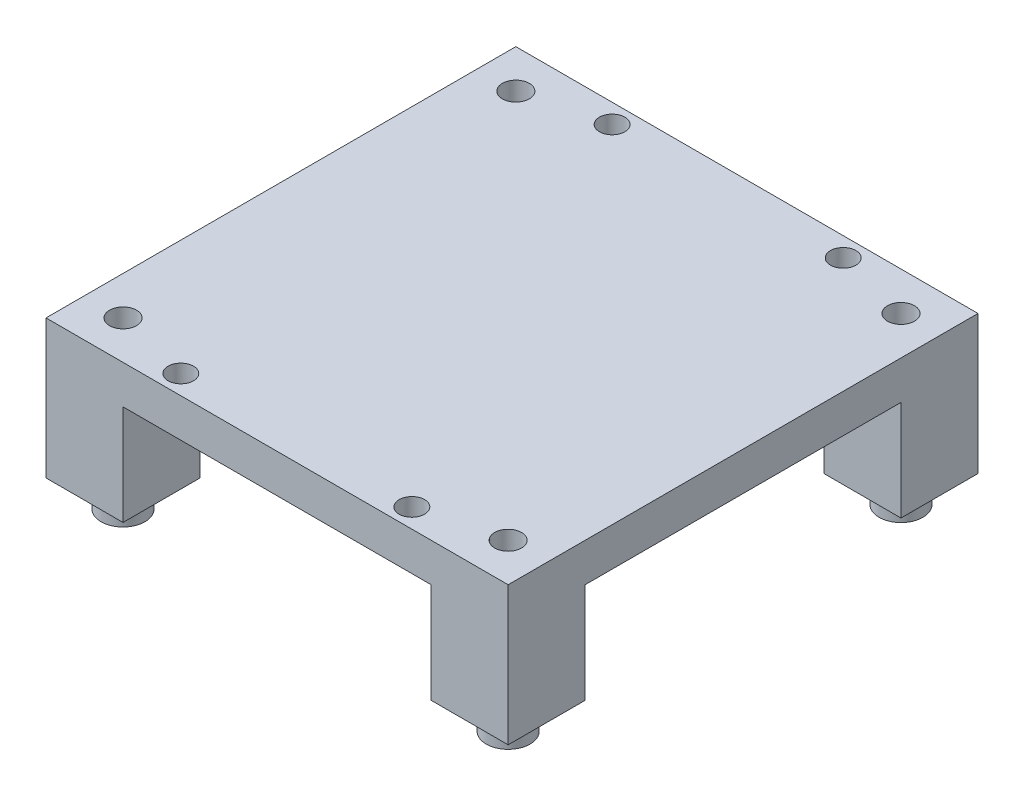
ISO-10303-21;
HEADER;
FILE_DESCRIPTION(('STEP AP214'),'2;1');
FILE_NAME('part.step','',(''),(''),'','','');
FILE_SCHEMA(('AUTOMOTIVE_DESIGN { 1 0 10303 214 1 1 1 1 }'));
ENDSEC;
DATA;
#1=APPLICATION_CONTEXT('core data for automotive mechanical design processes');
#2=APPLICATION_PROTOCOL_DEFINITION('international standard','automotive_design',2000,#1);
#3=PRODUCT_CONTEXT('',#1,'mechanical');
#4=PRODUCT('Part','Part','',(#3));
#5=PRODUCT_RELATED_PRODUCT_CATEGORY('part','',(#4));
#6=PRODUCT_DEFINITION_FORMATION('','',#4);
#7=PRODUCT_DEFINITION_CONTEXT('part definition',#1,'design');
#8=PRODUCT_DEFINITION('design','',#6,#7);
#9=PRODUCT_DEFINITION_SHAPE('','',#8);
#10=(LENGTH_UNIT() NAMED_UNIT(*) SI_UNIT(.MILLI.,.METRE.));
#11=(NAMED_UNIT(*) PLANE_ANGLE_UNIT() SI_UNIT($,.RADIAN.));
#12=(NAMED_UNIT(*) SI_UNIT($,.STERADIAN.) SOLID_ANGLE_UNIT());
#13=UNCERTAINTY_MEASURE_WITH_UNIT(LENGTH_MEASURE(1.E-05),#10,'distance_accuracy_value','');
#14=(GEOMETRIC_REPRESENTATION_CONTEXT(3) GLOBAL_UNCERTAINTY_ASSIGNED_CONTEXT((#13)) GLOBAL_UNIT_ASSIGNED_CONTEXT((#10,
#11,#12)) REPRESENTATION_CONTEXT('',''));
#15=CARTESIAN_POINT('',(0.,0.,0.));
#16=DIRECTION('',(0.,0.,1.));
#17=DIRECTION('',(1.,0.,0.));
#18=AXIS2_PLACEMENT_3D('',#15,#16,#17);
#19=CARTESIAN_POINT('',(0.,5.,0.));
#20=DIRECTION('',(0.,-1.,0.));
#21=DIRECTION('',(0.,0.,-1.));
#22=AXIS2_PLACEMENT_3D('',#19,#20,#21);
#23=PLANE('',#22);
#24=CARTESIAN_POINT('',(5.,5.,-5.));
#25=DIRECTION('',(0.,-1.,0.));
#26=DIRECTION('',(0.,0.,-1.));
#27=AXIS2_PLACEMENT_3D('',#24,#25,#26);
#28=CIRCLE('',#27,1.75000000000001);
#29=CARTESIAN_POINT('',(5.,5.,-6.75000000000001));
#30=VERTEX_POINT('',#29);
#31=EDGE_CURVE('E391',#30,#30,#28,.T.);
#32=ORIENTED_EDGE('',*,*,#31,.T.);
#33=EDGE_LOOP('',(#32));
#34=FACE_BOUND('',#33,.T.);
#35=CARTESIAN_POINT('',(5.,5.,-56.));
#36=DIRECTION('',(0.,-1.,0.));
#37=DIRECTION('',(0.,0.,-1.));
#38=AXIS2_PLACEMENT_3D('',#35,#36,#37);
#39=CIRCLE('',#38,1.75000000000001);
#40=CARTESIAN_POINT('',(5.,5.,-57.75));
#41=VERTEX_POINT('',#40);
#42=EDGE_CURVE('E388',#41,#41,#39,.T.);
#43=ORIENTED_EDGE('',*,*,#42,.T.);
#44=EDGE_LOOP('',(#43));
#45=FACE_BOUND('',#44,.T.);
#46=CARTESIAN_POINT('',(55.,5.,-56.));
#47=DIRECTION('',(0.,-1.,0.));
#48=DIRECTION('',(0.,0.,-1.));
#49=AXIS2_PLACEMENT_3D('',#46,#47,#48);
#50=CIRCLE('',#49,1.75000000000001);
#51=CARTESIAN_POINT('',(55.,5.,-57.75));
#52=VERTEX_POINT('',#51);
#53=EDGE_CURVE('E385',#52,#52,#50,.T.);
#54=ORIENTED_EDGE('',*,*,#53,.T.);
#55=EDGE_LOOP('',(#54));
#56=FACE_BOUND('',#55,.T.);
#57=CARTESIAN_POINT('',(55.,5.,-5.));
#58=DIRECTION('',(0.,-1.,0.));
#59=DIRECTION('',(0.,0.,-1.));
#60=AXIS2_PLACEMENT_3D('',#57,#58,#59);
#61=CIRCLE('',#60,1.75000000000001);
#62=CARTESIAN_POINT('',(55.,5.,-6.75000000000001));
#63=VERTEX_POINT('',#62);
#64=EDGE_CURVE('E380',#63,#63,#61,.T.);
#65=ORIENTED_EDGE('',*,*,#64,.T.);
#66=EDGE_LOOP('',(#65));
#67=FACE_BOUND('',#66,.T.);
#68=CARTESIAN_POINT('',(15.,5.,-58.5));
#69=DIRECTION('',(0.,1.,0.));
#70=DIRECTION('',(0.,0.,1.));
#71=AXIS2_PLACEMENT_3D('',#68,#69,#70);
#72=CIRCLE('',#71,1.65000000000001);
#73=CARTESIAN_POINT('',(15.,5.,-56.85));
#74=VERTEX_POINT('',#73);
#75=EDGE_CURVE('E209',#74,#74,#72,.T.);
#76=ORIENTED_EDGE('',*,*,#75,.F.);
#77=EDGE_LOOP('',(#76));
#78=FACE_BOUND('',#77,.T.);
#79=CARTESIAN_POINT('',(45.,5.,-2.49999999999999));
#80=DIRECTION('',(0.,1.,0.));
#81=DIRECTION('',(0.,0.,1.));
#82=AXIS2_PLACEMENT_3D('',#79,#80,#81);
#83=CIRCLE('',#82,1.65000000000001);
#84=CARTESIAN_POINT('',(45.,5.,-0.849999999999976));
#85=VERTEX_POINT('',#84);
#86=EDGE_CURVE('E354',#85,#85,#83,.T.);
#87=ORIENTED_EDGE('',*,*,#86,.F.);
#88=EDGE_LOOP('',(#87));
#89=FACE_BOUND('',#88,.T.);
#90=CARTESIAN_POINT('',(15.,5.,-2.49999999999999));
#91=DIRECTION('',(0.,1.,0.));
#92=DIRECTION('',(0.,0.,1.));
#93=AXIS2_PLACEMENT_3D('',#90,#91,#92);
#94=CIRCLE('',#93,1.65000000000001);
#95=CARTESIAN_POINT('',(15.,5.,-0.849999999999976));
#96=VERTEX_POINT('',#95);
#97=EDGE_CURVE('E348',#96,#96,#94,.T.);
#98=ORIENTED_EDGE('',*,*,#97,.F.);
#99=EDGE_LOOP('',(#98));
#100=FACE_BOUND('',#99,.T.);
#101=DIRECTION('',(0.,0.,1.));
#102=VECTOR('',#101,1.);
#103=CARTESIAN_POINT('',(0.,5.,0.));
#104=LINE('',#103,#102);
#105=CARTESIAN_POINT('',(0.,5.,-61.));
#106=VERTEX_POINT('',#105);
#107=CARTESIAN_POINT('',(0.,5.,0.));
#108=VERTEX_POINT('',#107);
#109=EDGE_CURVE('E197',#106,#108,#104,.T.);
#110=ORIENTED_EDGE('',*,*,#109,.T.);
#111=DIRECTION('',(1.,0.,0.));
#112=VECTOR('',#111,1.);
#113=CARTESIAN_POINT('',(0.,5.,0.));
#114=LINE('',#113,#112);
#115=CARTESIAN_POINT('',(60.,5.,0.));
#116=VERTEX_POINT('',#115);
#117=EDGE_CURVE('E288',#108,#116,#114,.T.);
#118=ORIENTED_EDGE('',*,*,#117,.T.);
#119=DIRECTION('',(0.,0.,-1.));
#120=VECTOR('',#119,1.);
#121=CARTESIAN_POINT('',(60.,5.,0.));
#122=LINE('',#121,#120);
#123=CARTESIAN_POINT('',(60.,5.,-61.));
#124=VERTEX_POINT('',#123);
#125=EDGE_CURVE('E289',#116,#124,#122,.T.);
#126=ORIENTED_EDGE('',*,*,#125,.T.);
#127=DIRECTION('',(-1.,0.,0.));
#128=VECTOR('',#127,1.);
#129=CARTESIAN_POINT('',(0.,5.,-61.));
#130=LINE('',#129,#128);
#131=EDGE_CURVE('E190',#124,#106,#130,.T.);
#132=ORIENTED_EDGE('',*,*,#131,.T.);
#133=EDGE_LOOP('',(#110,#118,#126,#132));
#134=FACE_BOUND('',#133,.T.);
#135=CARTESIAN_POINT('',(45.,5.,-58.5));
#136=DIRECTION('',(0.,1.,0.));
#137=DIRECTION('',(0.,0.,1.));
#138=AXIS2_PLACEMENT_3D('',#135,#136,#137);
#139=CIRCLE('',#138,1.65000000000001);
#140=CARTESIAN_POINT('',(45.,5.,-56.85));
#141=VERTEX_POINT('',#140);
#142=EDGE_CURVE('E208',#141,#141,#139,.T.);
#143=ORIENTED_EDGE('',*,*,#142,.F.);
#144=EDGE_LOOP('',(#143));
#145=FACE_BOUND('',#144,.T.);
#146=ADVANCED_FACE('F39',(#34,#45,#56,#67,#78,#89,#100,#134,#145),#23,.F.);
#147=CARTESIAN_POINT('',(0.,0.,0.));
#148=DIRECTION('',(0.,-1.,0.));
#149=DIRECTION('',(0.,0.,-1.));
#150=AXIS2_PLACEMENT_3D('',#147,#148,#149);
#151=PLANE('',#150);
#152=CARTESIAN_POINT('',(15.,0.,-58.5));
#153=DIRECTION('',(0.,-1.,0.));
#154=DIRECTION('',(0.,0.,-1.));
#155=AXIS2_PLACEMENT_3D('',#152,#153,#154);
#156=CIRCLE('',#155,1.65000000000001);
#157=CARTESIAN_POINT('',(15.,0.,-60.15));
#158=VERTEX_POINT('',#157);
#159=EDGE_CURVE('E206',#158,#158,#156,.T.);
#160=ORIENTED_EDGE('',*,*,#159,.F.);
#161=EDGE_LOOP('',(#160));
#162=FACE_BOUND('',#161,.T.);
#163=CARTESIAN_POINT('',(45.,0.,-58.5));
#164=DIRECTION('',(0.,-1.,0.));
#165=DIRECTION('',(0.,0.,-1.));
#166=AXIS2_PLACEMENT_3D('',#163,#164,#165);
#167=CIRCLE('',#166,1.65000000000001);
#168=CARTESIAN_POINT('',(45.,0.,-60.15));
#169=VERTEX_POINT('',#168);
#170=EDGE_CURVE('E357',#169,#169,#167,.T.);
#171=ORIENTED_EDGE('',*,*,#170,.F.);
#172=EDGE_LOOP('',(#171));
#173=FACE_BOUND('',#172,.T.);
#174=CARTESIAN_POINT('',(45.,0.,-2.49999999999999));
#175=DIRECTION('',(0.,-1.,0.));
#176=DIRECTION('',(0.,0.,-1.));
#177=AXIS2_PLACEMENT_3D('',#174,#175,#176);
#178=CIRCLE('',#177,1.65000000000001);
#179=CARTESIAN_POINT('',(45.,0.,-4.15));
#180=VERTEX_POINT('',#179);
#181=EDGE_CURVE('E351',#180,#180,#178,.T.);
#182=ORIENTED_EDGE('',*,*,#181,.F.);
#183=EDGE_LOOP('',(#182));
#184=FACE_BOUND('',#183,.T.);
#185=CARTESIAN_POINT('',(15.,0.,-2.49999999999999));
#186=DIRECTION('',(0.,-1.,0.));
#187=DIRECTION('',(0.,0.,-1.));
#188=AXIS2_PLACEMENT_3D('',#185,#186,#187);
#189=CIRCLE('',#188,1.65000000000001);
#190=CARTESIAN_POINT('',(15.,0.,-4.15));
#191=VERTEX_POINT('',#190);
#192=EDGE_CURVE('E339',#191,#191,#189,.T.);
#193=ORIENTED_EDGE('',*,*,#192,.F.);
#194=EDGE_LOOP('',(#193));
#195=FACE_BOUND('',#194,.T.);
#196=DIRECTION('',(-1.,0.,0.));
#197=VECTOR('',#196,1.);
#198=CARTESIAN_POINT('',(0.,0.,-51.));
#199=LINE('',#198,#197);
#200=CARTESIAN_POINT('',(10.,0.,-51.));
#201=VERTEX_POINT('',#200);
#202=CARTESIAN_POINT('',(0.,0.,-51.));
#203=VERTEX_POINT('',#202);
#204=EDGE_CURVE('E156',#201,#203,#199,.T.);
#205=ORIENTED_EDGE('',*,*,#204,.F.);
#206=DIRECTION('',(0.,0.,1.));
#207=VECTOR('',#206,1.);
#208=CARTESIAN_POINT('',(10.,0.,-61.));
#209=LINE('',#208,#207);
#210=CARTESIAN_POINT('',(10.,0.,-61.));
#211=VERTEX_POINT('',#210);
#212=EDGE_CURVE('E167',#211,#201,#209,.T.);
#213=ORIENTED_EDGE('',*,*,#212,.F.);
#214=DIRECTION('',(-1.,0.,0.));
#215=VECTOR('',#214,1.);
#216=CARTESIAN_POINT('',(0.,0.,-61.));
#217=LINE('',#216,#215);
#218=CARTESIAN_POINT('',(50.,0.,-61.));
#219=VERTEX_POINT('',#218);
#220=EDGE_CURVE('E195',#219,#211,#217,.T.);
#221=ORIENTED_EDGE('',*,*,#220,.F.);
#222=DIRECTION('',(0.,0.,-1.));
#223=VECTOR('',#222,1.);
#224=CARTESIAN_POINT('',(50.,0.,-61.));
#225=LINE('',#224,#223);
#226=CARTESIAN_POINT('',(50.,0.,-51.));
#227=VERTEX_POINT('',#226);
#228=EDGE_CURVE('E235',#227,#219,#225,.T.);
#229=ORIENTED_EDGE('',*,*,#228,.F.);
#230=DIRECTION('',(-1.,0.,0.));
#231=VECTOR('',#230,1.);
#232=CARTESIAN_POINT('',(60.,0.,-51.));
#233=LINE('',#232,#231);
#234=CARTESIAN_POINT('',(60.,0.,-51.));
#235=VERTEX_POINT('',#234);
#236=EDGE_CURVE('E237',#235,#227,#233,.T.);
#237=ORIENTED_EDGE('',*,*,#236,.F.);
#238=DIRECTION('',(0.,0.,-1.));
#239=VECTOR('',#238,1.);
#240=CARTESIAN_POINT('',(60.,0.,0.));
#241=LINE('',#240,#239);
#242=CARTESIAN_POINT('',(60.,0.,-10.));
#243=VERTEX_POINT('',#242);
#244=EDGE_CURVE('E185',#243,#235,#241,.T.);
#245=ORIENTED_EDGE('',*,*,#244,.F.);
#246=DIRECTION('',(1.,0.,0.));
#247=VECTOR('',#246,1.);
#248=CARTESIAN_POINT('',(60.,0.,-10.));
#249=LINE('',#248,#247);
#250=CARTESIAN_POINT('',(50.,0.,-10.));
#251=VERTEX_POINT('',#250);
#252=EDGE_CURVE('E255',#251,#243,#249,.T.);
#253=ORIENTED_EDGE('',*,*,#252,.F.);
#254=DIRECTION('',(0.,0.,-1.));
#255=VECTOR('',#254,1.);
#256=CARTESIAN_POINT('',(50.,0.,0.));
#257=LINE('',#256,#255);
#258=CARTESIAN_POINT('',(50.,0.,0.));
#259=VERTEX_POINT('',#258);
#260=EDGE_CURVE('E257',#259,#251,#257,.T.);
#261=ORIENTED_EDGE('',*,*,#260,.F.);
#262=DIRECTION('',(1.,0.,0.));
#263=VECTOR('',#262,1.);
#264=CARTESIAN_POINT('',(0.,0.,0.));
#265=LINE('',#264,#263);
#266=CARTESIAN_POINT('',(10.,0.,0.));
#267=VERTEX_POINT('',#266);
#268=EDGE_CURVE('E181',#267,#259,#265,.T.);
#269=ORIENTED_EDGE('',*,*,#268,.F.);
#270=DIRECTION('',(0.,0.,1.));
#271=VECTOR('',#270,1.);
#272=CARTESIAN_POINT('',(10.,0.,0.));
#273=LINE('',#272,#271);
#274=CARTESIAN_POINT('',(10.,0.,-10.));
#275=VERTEX_POINT('',#274);
#276=EDGE_CURVE('E271',#275,#267,#273,.T.);
#277=ORIENTED_EDGE('',*,*,#276,.F.);
#278=DIRECTION('',(1.,0.,0.));
#279=VECTOR('',#278,1.);
#280=CARTESIAN_POINT('',(0.,0.,-10.));
#281=LINE('',#280,#279);
#282=CARTESIAN_POINT('',(0.,0.,-10.));
#283=VERTEX_POINT('',#282);
#284=EDGE_CURVE('E179',#283,#275,#281,.T.);
#285=ORIENTED_EDGE('',*,*,#284,.F.);
#286=DIRECTION('',(0.,0.,1.));
#287=VECTOR('',#286,1.);
#288=CARTESIAN_POINT('',(0.,0.,0.));
#289=LINE('',#288,#287);
#290=EDGE_CURVE('E172',#203,#283,#289,.T.);
#291=ORIENTED_EDGE('',*,*,#290,.F.);
#292=EDGE_LOOP('',(#205,#213,#221,#229,#237,#245,#253,#261,#269,#277,#285,#291));
#293=FACE_BOUND('',#292,.T.);
#294=ADVANCED_FACE('F177',(#162,#173,#184,#195,#293),#151,.T.);
#295=CARTESIAN_POINT('',(0.,5.,0.));
#296=DIRECTION('',(1.,0.,0.));
#297=DIRECTION('',(0.,0.,-1.));
#298=AXIS2_PLACEMENT_3D('',#295,#296,#297);
#299=PLANE('',#298);
#300=DIRECTION('',(0.,-1.,0.));
#301=VECTOR('',#300,1.);
#302=CARTESIAN_POINT('',(0.,5.,-61.));
#303=LINE('',#302,#301);
#304=CARTESIAN_POINT('',(0.,-13.,-61.));
#305=VERTEX_POINT('',#304);
#306=EDGE_CURVE('E198',#106,#305,#303,.T.);
#307=ORIENTED_EDGE('',*,*,#306,.T.);
#308=DIRECTION('',(0.,0.,-1.));
#309=VECTOR('',#308,1.);
#310=CARTESIAN_POINT('',(0.,-13.,-61.));
#311=LINE('',#310,#309);
#312=CARTESIAN_POINT('',(0.,-13.,-51.));
#313=VERTEX_POINT('',#312);
#314=EDGE_CURVE('E168',#313,#305,#311,.T.);
#315=ORIENTED_EDGE('',*,*,#314,.F.);
#316=DIRECTION('',(0.,1.,0.));
#317=VECTOR('',#316,1.);
#318=CARTESIAN_POINT('',(0.,-13.,-51.));
#319=LINE('',#318,#317);
#320=EDGE_CURVE('E160',#313,#203,#319,.T.);
#321=ORIENTED_EDGE('',*,*,#320,.T.);
#322=ORIENTED_EDGE('',*,*,#290,.T.);
#323=DIRECTION('',(0.,1.,0.));
#324=VECTOR('',#323,1.);
#325=CARTESIAN_POINT('',(0.,-13.,-10.));
#326=LINE('',#325,#324);
#327=CARTESIAN_POINT('',(0.,-13.,-10.));
#328=VERTEX_POINT('',#327);
#329=EDGE_CURVE('E182',#328,#283,#326,.T.);
#330=ORIENTED_EDGE('',*,*,#329,.F.);
#331=DIRECTION('',(0.,0.,-1.));
#332=VECTOR('',#331,1.);
#333=CARTESIAN_POINT('',(0.,-13.,0.));
#334=LINE('',#333,#332);
#335=CARTESIAN_POINT('',(0.,-13.,0.));
#336=VERTEX_POINT('',#335);
#337=EDGE_CURVE('E267',#336,#328,#334,.T.);
#338=ORIENTED_EDGE('',*,*,#337,.F.);
#339=DIRECTION('',(0.,-1.,0.));
#340=VECTOR('',#339,1.);
#341=CARTESIAN_POINT('',(0.,5.,0.));
#342=LINE('',#341,#340);
#343=EDGE_CURVE('E204',#108,#336,#342,.T.);
#344=ORIENTED_EDGE('',*,*,#343,.F.);
#345=ORIENTED_EDGE('',*,*,#109,.F.);
#346=EDGE_LOOP('',(#307,#315,#321,#322,#330,#338,#344,#345));
#347=FACE_BOUND('',#346,.T.);
#348=ADVANCED_FACE('F41',(#347),#299,.F.);
#349=CARTESIAN_POINT('',(0.,5.,0.));
#350=DIRECTION('',(0.,0.,-1.));
#351=DIRECTION('',(-1.,0.,0.));
#352=AXIS2_PLACEMENT_3D('',#349,#350,#351);
#353=PLANE('',#352);
#354=ORIENTED_EDGE('',*,*,#343,.T.);
#355=DIRECTION('',(-1.,0.,0.));
#356=VECTOR('',#355,1.);
#357=CARTESIAN_POINT('',(0.,-13.,0.));
#358=LINE('',#357,#356);
#359=CARTESIAN_POINT('',(10.,-13.,0.));
#360=VERTEX_POINT('',#359);
#361=EDGE_CURVE('E275',#360,#336,#358,.T.);
#362=ORIENTED_EDGE('',*,*,#361,.F.);
#363=DIRECTION('',(0.,1.,0.));
#364=VECTOR('',#363,1.);
#365=CARTESIAN_POINT('',(10.,-13.,0.));
#366=LINE('',#365,#364);
#367=EDGE_CURVE('E278',#360,#267,#366,.T.);
#368=ORIENTED_EDGE('',*,*,#367,.T.);
#369=ORIENTED_EDGE('',*,*,#268,.T.);
#370=DIRECTION('',(0.,1.,0.));
#371=VECTOR('',#370,1.);
#372=CARTESIAN_POINT('',(50.,-13.,0.));
#373=LINE('',#372,#371);
#374=CARTESIAN_POINT('',(50.,-13.,0.));
#375=VERTEX_POINT('',#374);
#376=EDGE_CURVE('E240',#375,#259,#373,.T.);
#377=ORIENTED_EDGE('',*,*,#376,.F.);
#378=DIRECTION('',(-1.,0.,0.));
#379=VECTOR('',#378,1.);
#380=CARTESIAN_POINT('',(60.,-13.,0.));
#381=LINE('',#380,#379);
#382=CARTESIAN_POINT('',(60.,-13.,0.));
#383=VERTEX_POINT('',#382);
#384=EDGE_CURVE('E263',#383,#375,#381,.T.);
#385=ORIENTED_EDGE('',*,*,#384,.F.);
#386=DIRECTION('',(0.,-1.,0.));
#387=VECTOR('',#386,1.);
#388=CARTESIAN_POINT('',(60.,5.,0.));
#389=LINE('',#388,#387);
#390=EDGE_CURVE('E202',#116,#383,#389,.T.);
#391=ORIENTED_EDGE('',*,*,#390,.F.);
#392=ORIENTED_EDGE('',*,*,#117,.F.);
#393=EDGE_LOOP('',(#354,#362,#368,#369,#377,#385,#391,#392));
#394=FACE_BOUND('',#393,.T.);
#395=ADVANCED_FACE('F302',(#394),#353,.F.);
#396=CARTESIAN_POINT('',(60.,5.,0.));
#397=DIRECTION('',(-1.,0.,0.));
#398=DIRECTION('',(0.,0.,1.));
#399=AXIS2_PLACEMENT_3D('',#396,#397,#398);
#400=PLANE('',#399);
#401=ORIENTED_EDGE('',*,*,#390,.T.);
#402=DIRECTION('',(0.,0.,1.));
#403=VECTOR('',#402,1.);
#404=CARTESIAN_POINT('',(60.,-13.,0.));
#405=LINE('',#404,#403);
#406=CARTESIAN_POINT('',(60.,-13.,-10.));
#407=VERTEX_POINT('',#406);
#408=EDGE_CURVE('E258',#407,#383,#405,.T.);
#409=ORIENTED_EDGE('',*,*,#408,.F.);
#410=DIRECTION('',(0.,1.,0.));
#411=VECTOR('',#410,1.);
#412=CARTESIAN_POINT('',(60.,-13.,-10.));
#413=LINE('',#412,#411);
#414=EDGE_CURVE('E251',#407,#243,#413,.T.);
#415=ORIENTED_EDGE('',*,*,#414,.T.);
#416=ORIENTED_EDGE('',*,*,#244,.T.);
#417=DIRECTION('',(0.,1.,0.));
#418=VECTOR('',#417,1.);
#419=CARTESIAN_POINT('',(60.,-13.,-51.));
#420=LINE('',#419,#418);
#421=CARTESIAN_POINT('',(60.,-13.,-51.));
#422=VERTEX_POINT('',#421);
#423=EDGE_CURVE('E228',#422,#235,#420,.T.);
#424=ORIENTED_EDGE('',*,*,#423,.F.);
#425=DIRECTION('',(0.,0.,1.));
#426=VECTOR('',#425,1.);
#427=CARTESIAN_POINT('',(60.,-13.,-61.));
#428=LINE('',#427,#426);
#429=CARTESIAN_POINT('',(60.,-13.,-61.));
#430=VERTEX_POINT('',#429);
#431=EDGE_CURVE('E238',#430,#422,#428,.T.);
#432=ORIENTED_EDGE('',*,*,#431,.F.);
#433=DIRECTION('',(0.,-1.,0.));
#434=VECTOR('',#433,1.);
#435=CARTESIAN_POINT('',(60.,5.,-61.));
#436=LINE('',#435,#434);
#437=EDGE_CURVE('E200',#124,#430,#436,.T.);
#438=ORIENTED_EDGE('',*,*,#437,.F.);
#439=ORIENTED_EDGE('',*,*,#125,.F.);
#440=EDGE_LOOP('',(#401,#409,#415,#416,#424,#432,#438,#439));
#441=FACE_BOUND('',#440,.T.);
#442=ADVANCED_FACE('F324',(#441),#400,.F.);
#443=CARTESIAN_POINT('',(0.,5.,-61.));
#444=DIRECTION('',(0.,0.,1.));
#445=DIRECTION('',(1.,0.,0.));
#446=AXIS2_PLACEMENT_3D('',#443,#444,#445);
#447=PLANE('',#446);
#448=ORIENTED_EDGE('',*,*,#437,.T.);
#449=DIRECTION('',(1.,0.,0.));
#450=VECTOR('',#449,1.);
#451=CARTESIAN_POINT('',(60.,-13.,-61.));
#452=LINE('',#451,#450);
#453=CARTESIAN_POINT('',(50.,-13.,-61.));
#454=VERTEX_POINT('',#453);
#455=EDGE_CURVE('E234',#454,#430,#452,.T.);
#456=ORIENTED_EDGE('',*,*,#455,.F.);
#457=DIRECTION('',(0.,1.,0.));
#458=VECTOR('',#457,1.);
#459=CARTESIAN_POINT('',(50.,-13.,-61.));
#460=LINE('',#459,#458);
#461=EDGE_CURVE('E54',#454,#219,#460,.T.);
#462=ORIENTED_EDGE('',*,*,#461,.T.);
#463=ORIENTED_EDGE('',*,*,#220,.T.);
#464=DIRECTION('',(0.,1.,0.));
#465=VECTOR('',#464,1.);
#466=CARTESIAN_POINT('',(10.,-13.,-61.));
#467=LINE('',#466,#465);
#468=CARTESIAN_POINT('',(10.,-13.,-61.));
#469=VERTEX_POINT('',#468);
#470=EDGE_CURVE('E336',#469,#211,#467,.T.);
#471=ORIENTED_EDGE('',*,*,#470,.F.);
#472=DIRECTION('',(1.,0.,0.));
#473=VECTOR('',#472,1.);
#474=CARTESIAN_POINT('',(0.,-13.,-61.));
#475=LINE('',#474,#473);
#476=EDGE_CURVE('E221',#305,#469,#475,.T.);
#477=ORIENTED_EDGE('',*,*,#476,.F.);
#478=ORIENTED_EDGE('',*,*,#306,.F.);
#479=ORIENTED_EDGE('',*,*,#131,.F.);
#480=EDGE_LOOP('',(#448,#456,#462,#463,#471,#477,#478,#479));
#481=FACE_BOUND('',#480,.T.);
#482=ADVANCED_FACE('F298',(#481),#447,.F.);
#483=CARTESIAN_POINT('',(0.,-13.,-10.));
#484=DIRECTION('',(0.,0.,1.));
#485=DIRECTION('',(1.,0.,0.));
#486=AXIS2_PLACEMENT_3D('',#483,#484,#485);
#487=PLANE('',#486);
#488=ORIENTED_EDGE('',*,*,#284,.T.);
#489=DIRECTION('',(0.,1.,0.));
#490=VECTOR('',#489,1.);
#491=CARTESIAN_POINT('',(10.,-13.,-10.));
#492=LINE('',#491,#490);
#493=CARTESIAN_POINT('',(10.,-13.,-10.));
#494=VERTEX_POINT('',#493);
#495=EDGE_CURVE('E187',#494,#275,#492,.T.);
#496=ORIENTED_EDGE('',*,*,#495,.F.);
#497=DIRECTION('',(1.,0.,0.));
#498=VECTOR('',#497,1.);
#499=CARTESIAN_POINT('',(0.,-13.,-10.));
#500=LINE('',#499,#498);
#501=EDGE_CURVE('E270',#328,#494,#500,.T.);
#502=ORIENTED_EDGE('',*,*,#501,.F.);
#503=ORIENTED_EDGE('',*,*,#329,.T.);
#504=EDGE_LOOP('',(#488,#496,#502,#503));
#505=FACE_BOUND('',#504,.T.);
#506=ADVANCED_FACE('F433',(#505),#487,.F.);
#507=CARTESIAN_POINT('',(10.,-13.,0.));
#508=DIRECTION('',(-1.,0.,0.));
#509=DIRECTION('',(0.,0.,1.));
#510=AXIS2_PLACEMENT_3D('',#507,#508,#509);
#511=PLANE('',#510);
#512=ORIENTED_EDGE('',*,*,#276,.T.);
#513=ORIENTED_EDGE('',*,*,#367,.F.);
#514=DIRECTION('',(0.,0.,1.));
#515=VECTOR('',#514,1.);
#516=CARTESIAN_POINT('',(10.,-13.,0.));
#517=LINE('',#516,#515);
#518=EDGE_CURVE('E273',#494,#360,#517,.T.);
#519=ORIENTED_EDGE('',*,*,#518,.F.);
#520=ORIENTED_EDGE('',*,*,#495,.T.);
#521=EDGE_LOOP('',(#512,#513,#519,#520));
#522=FACE_BOUND('',#521,.T.);
#523=ADVANCED_FACE('F310',(#522),#511,.F.);
#524=CARTESIAN_POINT('',(0.,-13.,0.));
#525=DIRECTION('',(0.,-1.,0.));
#526=DIRECTION('',(0.,0.,-1.));
#527=AXIS2_PLACEMENT_3D('',#524,#525,#526);
#528=PLANE('',#527);
#529=CARTESIAN_POINT('',(5.,-13.,-5.));
#530=DIRECTION('',(0.,-1.,0.));
#531=DIRECTION('',(0.,0.,-1.));
#532=AXIS2_PLACEMENT_3D('',#529,#530,#531);
#533=CIRCLE('',#532,2.85);
#534=CARTESIAN_POINT('',(5.,-13.,-7.85));
#535=VERTEX_POINT('',#534);
#536=EDGE_CURVE('E376',#535,#535,#533,.T.);
#537=ORIENTED_EDGE('',*,*,#536,.F.);
#538=EDGE_LOOP('',(#537));
#539=FACE_BOUND('',#538,.T.);
#540=ORIENTED_EDGE('',*,*,#337,.T.);
#541=ORIENTED_EDGE('',*,*,#501,.T.);
#542=ORIENTED_EDGE('',*,*,#518,.T.);
#543=ORIENTED_EDGE('',*,*,#361,.T.);
#544=EDGE_LOOP('',(#540,#541,#542,#543));
#545=FACE_BOUND('',#544,.T.);
#546=ADVANCED_FACE('F305',(#539,#545),#528,.T.);
#547=CARTESIAN_POINT('',(50.,-13.,0.));
#548=DIRECTION('',(1.,0.,0.));
#549=DIRECTION('',(0.,0.,-1.));
#550=AXIS2_PLACEMENT_3D('',#547,#548,#549);
#551=PLANE('',#550);
#552=ORIENTED_EDGE('',*,*,#260,.T.);
#553=DIRECTION('',(0.,1.,0.));
#554=VECTOR('',#553,1.);
#555=CARTESIAN_POINT('',(50.,-13.,-10.));
#556=LINE('',#555,#554);
#557=CARTESIAN_POINT('',(50.,-13.,-10.));
#558=VERTEX_POINT('',#557);
#559=EDGE_CURVE('E62',#558,#251,#556,.T.);
#560=ORIENTED_EDGE('',*,*,#559,.F.);
#561=DIRECTION('',(0.,0.,-1.));
#562=VECTOR('',#561,1.);
#563=CARTESIAN_POINT('',(50.,-13.,0.));
#564=LINE('',#563,#562);
#565=EDGE_CURVE('E261',#375,#558,#564,.T.);
#566=ORIENTED_EDGE('',*,*,#565,.F.);
#567=ORIENTED_EDGE('',*,*,#376,.T.);
#568=EDGE_LOOP('',(#552,#560,#566,#567));
#569=FACE_BOUND('',#568,.T.);
#570=ADVANCED_FACE('F318',(#569),#551,.F.);
#571=CARTESIAN_POINT('',(60.,-13.,-10.));
#572=DIRECTION('',(0.,0.,1.));
#573=DIRECTION('',(1.,0.,0.));
#574=AXIS2_PLACEMENT_3D('',#571,#572,#573);
#575=PLANE('',#574);
#576=ORIENTED_EDGE('',*,*,#252,.T.);
#577=ORIENTED_EDGE('',*,*,#414,.F.);
#578=DIRECTION('',(1.,0.,0.));
#579=VECTOR('',#578,1.);
#580=CARTESIAN_POINT('',(60.,-13.,-10.));
#581=LINE('',#580,#579);
#582=EDGE_CURVE('E254',#558,#407,#581,.T.);
#583=ORIENTED_EDGE('',*,*,#582,.F.);
#584=ORIENTED_EDGE('',*,*,#559,.T.);
#585=EDGE_LOOP('',(#576,#577,#583,#584));
#586=FACE_BOUND('',#585,.T.);
#587=ADVANCED_FACE('F430',(#586),#575,.F.);
#588=CARTESIAN_POINT('',(0.,-13.,0.));
#589=DIRECTION('',(0.,1.,0.));
#590=DIRECTION('',(0.,0.,1.));
#591=AXIS2_PLACEMENT_3D('',#588,#589,#590);
#592=PLANE('',#591);
#593=CARTESIAN_POINT('',(55.,-13.,-5.));
#594=DIRECTION('',(0.,1.,0.));
#595=DIRECTION('',(0.,0.,1.));
#596=AXIS2_PLACEMENT_3D('',#593,#594,#595);
#597=CIRCLE('',#596,2.85);
#598=CARTESIAN_POINT('',(55.,-13.,-2.15000000000001));
#599=VERTEX_POINT('',#598);
#600=EDGE_CURVE('E11',#599,#599,#597,.F.);
#601=ORIENTED_EDGE('',*,*,#600,.F.);
#602=EDGE_LOOP('',(#601));
#603=FACE_BOUND('',#602,.T.);
#604=ORIENTED_EDGE('',*,*,#408,.T.);
#605=ORIENTED_EDGE('',*,*,#384,.T.);
#606=ORIENTED_EDGE('',*,*,#565,.T.);
#607=ORIENTED_EDGE('',*,*,#582,.T.);
#608=EDGE_LOOP('',(#604,#605,#606,#607));
#609=FACE_BOUND('',#608,.T.);
#610=ADVANCED_FACE('F320',(#603,#609),#592,.F.);
#611=CARTESIAN_POINT('',(60.,-13.,-51.));
#612=DIRECTION('',(0.,0.,-1.));
#613=DIRECTION('',(-1.,0.,0.));
#614=AXIS2_PLACEMENT_3D('',#611,#612,#613);
#615=PLANE('',#614);
#616=ORIENTED_EDGE('',*,*,#236,.T.);
#617=DIRECTION('',(0.,1.,0.));
#618=VECTOR('',#617,1.);
#619=CARTESIAN_POINT('',(50.,-13.,-51.));
#620=LINE('',#619,#618);
#621=CARTESIAN_POINT('',(50.,-13.,-51.));
#622=VERTEX_POINT('',#621);
#623=EDGE_CURVE('E230',#622,#227,#620,.T.);
#624=ORIENTED_EDGE('',*,*,#623,.F.);
#625=DIRECTION('',(-1.,0.,0.));
#626=VECTOR('',#625,1.);
#627=CARTESIAN_POINT('',(60.,-13.,-51.));
#628=LINE('',#627,#626);
#629=EDGE_CURVE('E245',#422,#622,#628,.T.);
#630=ORIENTED_EDGE('',*,*,#629,.F.);
#631=ORIENTED_EDGE('',*,*,#423,.T.);
#632=EDGE_LOOP('',(#616,#624,#630,#631));
#633=FACE_BOUND('',#632,.T.);
#634=ADVANCED_FACE('F534',(#633),#615,.F.);
#635=CARTESIAN_POINT('',(50.,-13.,-61.));
#636=DIRECTION('',(1.,0.,0.));
#637=DIRECTION('',(0.,0.,-1.));
#638=AXIS2_PLACEMENT_3D('',#635,#636,#637);
#639=PLANE('',#638);
#640=ORIENTED_EDGE('',*,*,#228,.T.);
#641=ORIENTED_EDGE('',*,*,#461,.F.);
#642=DIRECTION('',(0.,0.,-1.));
#643=VECTOR('',#642,1.);
#644=CARTESIAN_POINT('',(50.,-13.,-61.));
#645=LINE('',#644,#643);
#646=EDGE_CURVE('E243',#622,#454,#645,.T.);
#647=ORIENTED_EDGE('',*,*,#646,.F.);
#648=ORIENTED_EDGE('',*,*,#623,.T.);
#649=EDGE_LOOP('',(#640,#641,#647,#648));
#650=FACE_BOUND('',#649,.T.);
#651=ADVANCED_FACE('F332',(#650),#639,.F.);
#652=CARTESIAN_POINT('',(0.,-13.,0.));
#653=DIRECTION('',(0.,-1.,0.));
#654=DIRECTION('',(0.,0.,-1.));
#655=AXIS2_PLACEMENT_3D('',#652,#653,#654);
#656=PLANE('',#655);
#657=CARTESIAN_POINT('',(55.,-13.,-56.));
#658=DIRECTION('',(0.,-1.,0.));
#659=DIRECTION('',(0.,0.,-1.));
#660=AXIS2_PLACEMENT_3D('',#657,#658,#659);
#661=CIRCLE('',#660,2.85);
#662=CARTESIAN_POINT('',(55.,-13.,-58.85));
#663=VERTEX_POINT('',#662);
#664=EDGE_CURVE('E367',#663,#663,#661,.T.);
#665=ORIENTED_EDGE('',*,*,#664,.F.);
#666=EDGE_LOOP('',(#665));
#667=FACE_BOUND('',#666,.T.);
#668=ORIENTED_EDGE('',*,*,#431,.T.);
#669=ORIENTED_EDGE('',*,*,#629,.T.);
#670=ORIENTED_EDGE('',*,*,#646,.T.);
#671=ORIENTED_EDGE('',*,*,#455,.T.);
#672=EDGE_LOOP('',(#668,#669,#670,#671));
#673=FACE_BOUND('',#672,.T.);
#674=ADVANCED_FACE('F328',(#667,#673),#656,.T.);
#675=CARTESIAN_POINT('',(10.,-13.,-61.));
#676=DIRECTION('',(-1.,0.,0.));
#677=DIRECTION('',(0.,0.,1.));
#678=AXIS2_PLACEMENT_3D('',#675,#676,#677);
#679=PLANE('',#678);
#680=ORIENTED_EDGE('',*,*,#212,.T.);
#681=DIRECTION('',(0.,1.,0.));
#682=VECTOR('',#681,1.);
#683=CARTESIAN_POINT('',(10.,-13.,-51.));
#684=LINE('',#683,#682);
#685=CARTESIAN_POINT('',(10.,-13.,-51.));
#686=VERTEX_POINT('',#685);
#687=EDGE_CURVE('E163',#686,#201,#684,.T.);
#688=ORIENTED_EDGE('',*,*,#687,.F.);
#689=DIRECTION('',(0.,0.,1.));
#690=VECTOR('',#689,1.);
#691=CARTESIAN_POINT('',(10.,-13.,-61.));
#692=LINE('',#691,#690);
#693=EDGE_CURVE('E224',#469,#686,#692,.T.);
#694=ORIENTED_EDGE('',*,*,#693,.F.);
#695=ORIENTED_EDGE('',*,*,#470,.T.);
#696=EDGE_LOOP('',(#680,#688,#694,#695));
#697=FACE_BOUND('',#696,.T.);
#698=ADVANCED_FACE('F341',(#697),#679,.F.);
#699=CARTESIAN_POINT('',(0.,-13.,-51.));
#700=DIRECTION('',(0.,0.,-1.));
#701=DIRECTION('',(-1.,0.,0.));
#702=AXIS2_PLACEMENT_3D('',#699,#700,#701);
#703=PLANE('',#702);
#704=ORIENTED_EDGE('',*,*,#204,.T.);
#705=ORIENTED_EDGE('',*,*,#320,.F.);
#706=DIRECTION('',(-1.,0.,0.));
#707=VECTOR('',#706,1.);
#708=CARTESIAN_POINT('',(0.,-13.,-51.));
#709=LINE('',#708,#707);
#710=EDGE_CURVE('E175',#686,#313,#709,.T.);
#711=ORIENTED_EDGE('',*,*,#710,.F.);
#712=ORIENTED_EDGE('',*,*,#687,.T.);
#713=EDGE_LOOP('',(#704,#705,#711,#712));
#714=FACE_BOUND('',#713,.T.);
#715=ADVANCED_FACE('F158',(#714),#703,.F.);
#716=CARTESIAN_POINT('',(0.,-13.,0.));
#717=DIRECTION('',(0.,1.,0.));
#718=DIRECTION('',(0.,0.,1.));
#719=AXIS2_PLACEMENT_3D('',#716,#717,#718);
#720=PLANE('',#719);
#721=CARTESIAN_POINT('',(5.,-13.,-56.));
#722=DIRECTION('',(0.,1.,0.));
#723=DIRECTION('',(0.,0.,1.));
#724=AXIS2_PLACEMENT_3D('',#721,#722,#723);
#725=CIRCLE('',#724,2.85);
#726=CARTESIAN_POINT('',(5.,-13.,-53.15));
#727=VERTEX_POINT('',#726);
#728=EDGE_CURVE('E47',#727,#727,#725,.F.);
#729=ORIENTED_EDGE('',*,*,#728,.F.);
#730=EDGE_LOOP('',(#729));
#731=FACE_BOUND('',#730,.T.);
#732=ORIENTED_EDGE('',*,*,#314,.T.);
#733=ORIENTED_EDGE('',*,*,#476,.T.);
#734=ORIENTED_EDGE('',*,*,#693,.T.);
#735=ORIENTED_EDGE('',*,*,#710,.T.);
#736=EDGE_LOOP('',(#732,#733,#734,#735));
#737=FACE_BOUND('',#736,.T.);
#738=ADVANCED_FACE('F215',(#731,#737),#720,.F.);
#739=CARTESIAN_POINT('',(15.,5.,-2.49999999999999));
#740=DIRECTION('',(0.,1.,0.));
#741=DIRECTION('',(0.,0.,1.));
#742=AXIS2_PLACEMENT_3D('',#739,#740,#741);
#743=CYLINDRICAL_SURFACE('',#742,1.65000000000001);
#744=ORIENTED_EDGE('',*,*,#192,.T.);
#745=EDGE_LOOP('',(#744));
#746=FACE_BOUND('',#745,.T.);
#747=ORIENTED_EDGE('',*,*,#97,.T.);
#748=EDGE_LOOP('',(#747));
#749=FACE_BOUND('',#748,.T.);
#750=ADVANCED_FACE('F218',(#746,#749),#743,.F.);
#751=CARTESIAN_POINT('',(45.,5.,-2.49999999999999));
#752=DIRECTION('',(0.,1.,0.));
#753=DIRECTION('',(0.,0.,1.));
#754=AXIS2_PLACEMENT_3D('',#751,#752,#753);
#755=CYLINDRICAL_SURFACE('',#754,1.65000000000001);
#756=ORIENTED_EDGE('',*,*,#181,.T.);
#757=EDGE_LOOP('',(#756));
#758=FACE_BOUND('',#757,.T.);
#759=ORIENTED_EDGE('',*,*,#86,.T.);
#760=EDGE_LOOP('',(#759));
#761=FACE_BOUND('',#760,.T.);
#762=ADVANCED_FACE('F595',(#758,#761),#755,.F.);
#763=CARTESIAN_POINT('',(45.,5.,-58.5));
#764=DIRECTION('',(0.,1.,0.));
#765=DIRECTION('',(0.,0.,1.));
#766=AXIS2_PLACEMENT_3D('',#763,#764,#765);
#767=CYLINDRICAL_SURFACE('',#766,1.65000000000001);
#768=ORIENTED_EDGE('',*,*,#170,.T.);
#769=EDGE_LOOP('',(#768));
#770=FACE_BOUND('',#769,.T.);
#771=ORIENTED_EDGE('',*,*,#142,.T.);
#772=EDGE_LOOP('',(#771));
#773=FACE_BOUND('',#772,.T.);
#774=ADVANCED_FACE('F605',(#770,#773),#767,.F.);
#775=CARTESIAN_POINT('',(15.,5.,-58.5));
#776=DIRECTION('',(0.,1.,0.));
#777=DIRECTION('',(0.,0.,1.));
#778=AXIS2_PLACEMENT_3D('',#775,#776,#777);
#779=CYLINDRICAL_SURFACE('',#778,1.65000000000001);
#780=ORIENTED_EDGE('',*,*,#159,.T.);
#781=EDGE_LOOP('',(#780));
#782=FACE_BOUND('',#781,.T.);
#783=ORIENTED_EDGE('',*,*,#75,.T.);
#784=EDGE_LOOP('',(#783));
#785=FACE_BOUND('',#784,.T.);
#786=ADVANCED_FACE('F615',(#782,#785),#779,.F.);
#787=CARTESIAN_POINT('',(5.,-16.5,-56.));
#788=DIRECTION('',(0.,1.,0.));
#789=DIRECTION('',(0.,0.,1.));
#790=AXIS2_PLACEMENT_3D('',#787,#788,#789);
#791=CYLINDRICAL_SURFACE('',#790,2.85);
#792=CARTESIAN_POINT('',(5.,-16.5,-56.));
#793=DIRECTION('',(0.,-1.,0.));
#794=DIRECTION('',(0.,0.,-1.));
#795=AXIS2_PLACEMENT_3D('',#792,#793,#794);
#796=CIRCLE('',#795,2.85);
#797=CARTESIAN_POINT('',(5.,-16.5,-58.85));
#798=VERTEX_POINT('',#797);
#799=EDGE_CURVE('E364',#798,#798,#796,.T.);
#800=ORIENTED_EDGE('',*,*,#799,.F.);
#801=EDGE_LOOP('',(#800));
#802=FACE_BOUND('',#801,.T.);
#803=ORIENTED_EDGE('',*,*,#728,.T.);
#804=EDGE_LOOP('',(#803));
#805=FACE_BOUND('',#804,.T.);
#806=ADVANCED_FACE('F213',(#802,#805),#791,.T.);
#807=CARTESIAN_POINT('',(5.,-16.5,-56.));
#808=DIRECTION('',(0.,-1.,0.));
#809=DIRECTION('',(0.,0.,-1.));
#810=AXIS2_PLACEMENT_3D('',#807,#808,#809);
#811=PLANE('',#810);
#812=CARTESIAN_POINT('',(5.,-16.5,-56.));
#813=DIRECTION('',(0.,-1.,0.));
#814=DIRECTION('',(0.,0.,-1.));
#815=AXIS2_PLACEMENT_3D('',#812,#813,#814);
#816=CIRCLE('',#815,1.75000000000001);
#817=CARTESIAN_POINT('',(5.,-16.5,-57.75));
#818=VERTEX_POINT('',#817);
#819=EDGE_CURVE('E400',#818,#818,#816,.T.);
#820=ORIENTED_EDGE('',*,*,#819,.F.);
#821=EDGE_LOOP('',(#820));
#822=FACE_BOUND('',#821,.T.);
#823=ORIENTED_EDGE('',*,*,#799,.T.);
#824=EDGE_LOOP('',(#823));
#825=FACE_BOUND('',#824,.T.);
#826=ADVANCED_FACE('F632',(#822,#825),#811,.T.);
#827=CARTESIAN_POINT('',(55.,-16.5,-56.));
#828=DIRECTION('',(0.,1.,0.));
#829=DIRECTION('',(0.,0.,1.));
#830=AXIS2_PLACEMENT_3D('',#827,#828,#829);
#831=CYLINDRICAL_SURFACE('',#830,2.85);
#832=CARTESIAN_POINT('',(55.,-16.5,-56.));
#833=DIRECTION('',(0.,-1.,0.));
#834=DIRECTION('',(0.,0.,-1.));
#835=AXIS2_PLACEMENT_3D('',#832,#833,#834);
#836=CIRCLE('',#835,2.85);
#837=CARTESIAN_POINT('',(55.,-16.5,-58.85));
#838=VERTEX_POINT('',#837);
#839=EDGE_CURVE('E368',#838,#838,#836,.T.);
#840=ORIENTED_EDGE('',*,*,#839,.F.);
#841=EDGE_LOOP('',(#840));
#842=FACE_BOUND('',#841,.T.);
#843=ORIENTED_EDGE('',*,*,#664,.T.);
#844=EDGE_LOOP('',(#843));
#845=FACE_BOUND('',#844,.T.);
#846=ADVANCED_FACE('F642',(#842,#845),#831,.T.);
#847=CARTESIAN_POINT('',(55.,-16.5,-56.));
#848=DIRECTION('',(0.,-1.,0.));
#849=DIRECTION('',(0.,0.,-1.));
#850=AXIS2_PLACEMENT_3D('',#847,#848,#849);
#851=PLANE('',#850);
#852=CARTESIAN_POINT('',(55.,-16.5,-56.));
#853=DIRECTION('',(0.,-1.,0.));
#854=DIRECTION('',(0.,0.,-1.));
#855=AXIS2_PLACEMENT_3D('',#852,#853,#854);
#856=CIRCLE('',#855,1.75000000000002);
#857=CARTESIAN_POINT('',(55.,-16.5,-57.75));
#858=VERTEX_POINT('',#857);
#859=EDGE_CURVE('E397',#858,#858,#856,.T.);
#860=ORIENTED_EDGE('',*,*,#859,.F.);
#861=EDGE_LOOP('',(#860));
#862=FACE_BOUND('',#861,.T.);
#863=ORIENTED_EDGE('',*,*,#839,.T.);
#864=EDGE_LOOP('',(#863));
#865=FACE_BOUND('',#864,.T.);
#866=ADVANCED_FACE('F652',(#862,#865),#851,.T.);
#867=CARTESIAN_POINT('',(55.,-16.5,-5.));
#868=DIRECTION('',(0.,1.,0.));
#869=DIRECTION('',(0.,0.,1.));
#870=AXIS2_PLACEMENT_3D('',#867,#868,#869);
#871=CYLINDRICAL_SURFACE('',#870,2.85);
#872=CARTESIAN_POINT('',(55.,-16.5,-5.));
#873=DIRECTION('',(0.,-1.,0.));
#874=DIRECTION('',(0.,0.,-1.));
#875=AXIS2_PLACEMENT_3D('',#872,#873,#874);
#876=CIRCLE('',#875,2.85);
#877=CARTESIAN_POINT('',(55.,-16.5,-7.85));
#878=VERTEX_POINT('',#877);
#879=EDGE_CURVE('E371',#878,#878,#876,.T.);
#880=ORIENTED_EDGE('',*,*,#879,.F.);
#881=EDGE_LOOP('',(#880));
#882=FACE_BOUND('',#881,.T.);
#883=ORIENTED_EDGE('',*,*,#600,.T.);
#884=EDGE_LOOP('',(#883));
#885=FACE_BOUND('',#884,.T.);
#886=ADVANCED_FACE('F662',(#882,#885),#871,.T.);
#887=CARTESIAN_POINT('',(55.,-16.5,-5.));
#888=DIRECTION('',(0.,-1.,0.));
#889=DIRECTION('',(0.,0.,-1.));
#890=AXIS2_PLACEMENT_3D('',#887,#888,#889);
#891=PLANE('',#890);
#892=CARTESIAN_POINT('',(55.,-16.5,-5.));
#893=DIRECTION('',(0.,-1.,0.));
#894=DIRECTION('',(0.,0.,-1.));
#895=AXIS2_PLACEMENT_3D('',#892,#893,#894);
#896=CIRCLE('',#895,1.75000000000002);
#897=CARTESIAN_POINT('',(55.,-16.5,-6.75000000000002));
#898=VERTEX_POINT('',#897);
#899=EDGE_CURVE('E394',#898,#898,#896,.T.);
#900=ORIENTED_EDGE('',*,*,#899,.F.);
#901=EDGE_LOOP('',(#900));
#902=FACE_BOUND('',#901,.T.);
#903=ORIENTED_EDGE('',*,*,#879,.T.);
#904=EDGE_LOOP('',(#903));
#905=FACE_BOUND('',#904,.T.);
#906=ADVANCED_FACE('F419',(#902,#905),#891,.T.);
#907=CARTESIAN_POINT('',(5.,-16.5,-5.));
#908=DIRECTION('',(0.,1.,0.));
#909=DIRECTION('',(0.,0.,1.));
#910=AXIS2_PLACEMENT_3D('',#907,#908,#909);
#911=CYLINDRICAL_SURFACE('',#910,2.85);
#912=CARTESIAN_POINT('',(5.,-16.5,-5.));
#913=DIRECTION('',(0.,-1.,0.));
#914=DIRECTION('',(0.,0.,-1.));
#915=AXIS2_PLACEMENT_3D('',#912,#913,#914);
#916=CIRCLE('',#915,2.85);
#917=CARTESIAN_POINT('',(5.,-16.5,-7.85));
#918=VERTEX_POINT('',#917);
#919=EDGE_CURVE('E377',#918,#918,#916,.T.);
#920=ORIENTED_EDGE('',*,*,#919,.F.);
#921=EDGE_LOOP('',(#920));
#922=FACE_BOUND('',#921,.T.);
#923=ORIENTED_EDGE('',*,*,#536,.T.);
#924=EDGE_LOOP('',(#923));
#925=FACE_BOUND('',#924,.T.);
#926=ADVANCED_FACE('F413',(#922,#925),#911,.T.);
#927=CARTESIAN_POINT('',(5.,-16.5,-5.));
#928=DIRECTION('',(0.,-1.,0.));
#929=DIRECTION('',(0.,0.,-1.));
#930=AXIS2_PLACEMENT_3D('',#927,#928,#929);
#931=PLANE('',#930);
#932=CARTESIAN_POINT('',(5.,-16.5,-5.));
#933=DIRECTION('',(0.,-1.,0.));
#934=DIRECTION('',(0.,0.,-1.));
#935=AXIS2_PLACEMENT_3D('',#932,#933,#934);
#936=CIRCLE('',#935,1.75000000000001);
#937=CARTESIAN_POINT('',(5.,-16.5,-6.75000000000001));
#938=VERTEX_POINT('',#937);
#939=EDGE_CURVE('E403',#938,#938,#936,.T.);
#940=ORIENTED_EDGE('',*,*,#939,.F.);
#941=EDGE_LOOP('',(#940));
#942=FACE_BOUND('',#941,.T.);
#943=ORIENTED_EDGE('',*,*,#919,.T.);
#944=EDGE_LOOP('',(#943));
#945=FACE_BOUND('',#944,.T.);
#946=ADVANCED_FACE('F409',(#942,#945),#931,.T.);
#947=CARTESIAN_POINT('',(55.,-13.,-5.));
#948=DIRECTION('',(0.,-1.,0.));
#949=DIRECTION('',(0.,0.,-1.));
#950=AXIS2_PLACEMENT_3D('',#947,#948,#949);
#951=CYLINDRICAL_SURFACE('',#950,1.75000000000001);
#952=ORIENTED_EDGE('',*,*,#64,.F.);
#953=EDGE_LOOP('',(#952));
#954=FACE_BOUND('',#953,.T.);
#955=ORIENTED_EDGE('',*,*,#899,.T.);
#956=EDGE_LOOP('',(#955));
#957=FACE_BOUND('',#956,.T.);
#958=ADVANCED_FACE('F412',(#954,#957),#951,.F.);
#959=CARTESIAN_POINT('',(55.,-13.,-56.));
#960=DIRECTION('',(0.,-1.,0.));
#961=DIRECTION('',(0.,0.,-1.));
#962=AXIS2_PLACEMENT_3D('',#959,#960,#961);
#963=CYLINDRICAL_SURFACE('',#962,1.75000000000001);
#964=ORIENTED_EDGE('',*,*,#53,.F.);
#965=EDGE_LOOP('',(#964));
#966=FACE_BOUND('',#965,.T.);
#967=ORIENTED_EDGE('',*,*,#859,.T.);
#968=EDGE_LOOP('',(#967));
#969=FACE_BOUND('',#968,.T.);
#970=ADVANCED_FACE('F702',(#966,#969),#963,.F.);
#971=CARTESIAN_POINT('',(5.,-13.,-56.));
#972=DIRECTION('',(0.,-1.,0.));
#973=DIRECTION('',(0.,0.,-1.));
#974=AXIS2_PLACEMENT_3D('',#971,#972,#973);
#975=CYLINDRICAL_SURFACE('',#974,1.75000000000001);
#976=ORIENTED_EDGE('',*,*,#42,.F.);
#977=EDGE_LOOP('',(#976));
#978=FACE_BOUND('',#977,.T.);
#979=ORIENTED_EDGE('',*,*,#819,.T.);
#980=EDGE_LOOP('',(#979));
#981=FACE_BOUND('',#980,.T.);
#982=ADVANCED_FACE('F715',(#978,#981),#975,.F.);
#983=CARTESIAN_POINT('',(5.,-13.,-5.));
#984=DIRECTION('',(0.,-1.,0.));
#985=DIRECTION('',(0.,0.,-1.));
#986=AXIS2_PLACEMENT_3D('',#983,#984,#985);
#987=CYLINDRICAL_SURFACE('',#986,1.75000000000001);
#988=ORIENTED_EDGE('',*,*,#31,.F.);
#989=EDGE_LOOP('',(#988));
#990=FACE_BOUND('',#989,.T.);
#991=ORIENTED_EDGE('',*,*,#939,.T.);
#992=EDGE_LOOP('',(#991));
#993=FACE_BOUND('',#992,.T.);
#994=ADVANCED_FACE('F407',(#990,#993),#987,.F.);
#995=CLOSED_SHELL('',(#146,#294,#348,#395,#442,#482,#506,#523,#546,#570,#587,#610,#634,#651,
#674,#698,#715,#738,#750,#762,#774,#786,#806,#826,#846,#866,#886,#906,#926,#946,#958,#970,#982,#994));
#996=MANIFOLD_SOLID_BREP('B2',#995);
#997=ADVANCED_BREP_SHAPE_REPRESENTATION('',(#18,#996),#14);
#998=SHAPE_DEFINITION_REPRESENTATION(#9,#997);
ENDSEC;
END-ISO-10303-21;
